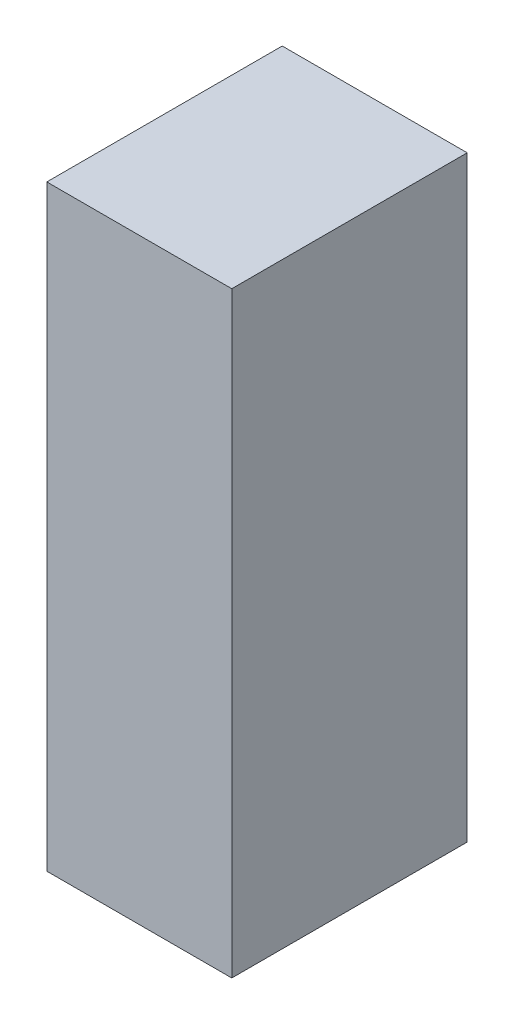
ISO-10303-21;
HEADER;
FILE_DESCRIPTION(('STEP AP214'),'2;1');
FILE_NAME('part.step','',(''),(''),'','','');
FILE_SCHEMA(('AUTOMOTIVE_DESIGN { 1 0 10303 214 1 1 1 1 }'));
ENDSEC;
DATA;
#1=APPLICATION_CONTEXT('core data for automotive mechanical design processes');
#2=APPLICATION_PROTOCOL_DEFINITION('international standard','automotive_design',2000,#1);
#3=PRODUCT_CONTEXT('',#1,'mechanical');
#4=PRODUCT('Part','Part','',(#3));
#5=PRODUCT_RELATED_PRODUCT_CATEGORY('part','',(#4));
#6=PRODUCT_DEFINITION_FORMATION('','',#4);
#7=PRODUCT_DEFINITION_CONTEXT('part definition',#1,'design');
#8=PRODUCT_DEFINITION('design','',#6,#7);
#9=PRODUCT_DEFINITION_SHAPE('','',#8);
#10=(LENGTH_UNIT() NAMED_UNIT(*) SI_UNIT(.MILLI.,.METRE.));
#11=(NAMED_UNIT(*) PLANE_ANGLE_UNIT() SI_UNIT($,.RADIAN.));
#12=(NAMED_UNIT(*) SI_UNIT($,.STERADIAN.) SOLID_ANGLE_UNIT());
#13=UNCERTAINTY_MEASURE_WITH_UNIT(LENGTH_MEASURE(1.E-05),#10,'distance_accuracy_value','');
#14=(GEOMETRIC_REPRESENTATION_CONTEXT(3) GLOBAL_UNCERTAINTY_ASSIGNED_CONTEXT((#13)) GLOBAL_UNIT_ASSIGNED_CONTEXT((#10,
#11,#12)) REPRESENTATION_CONTEXT('',''));
#15=CARTESIAN_POINT('',(0.,0.,0.));
#16=DIRECTION('',(0.,0.,1.));
#17=DIRECTION('',(1.,0.,0.));
#18=AXIS2_PLACEMENT_3D('',#15,#16,#17);
#19=CARTESIAN_POINT('',(-22.,71.,56.));
#20=DIRECTION('',(1.,0.,0.));
#21=DIRECTION('',(0.,0.,-1.));
#22=AXIS2_PLACEMENT_3D('',#19,#20,#21);
#23=PLANE('',#22);
#24=DIRECTION('',(0.,-1.,0.));
#25=VECTOR('',#24,1.);
#26=CARTESIAN_POINT('',(-22.,71.,0.));
#27=LINE('',#26,#25);
#28=CARTESIAN_POINT('',(-22.,71.,0.));
#29=VERTEX_POINT('',#28);
#30=CARTESIAN_POINT('',(-22.,-71.,0.));
#31=VERTEX_POINT('',#30);
#32=EDGE_CURVE('E102',#29,#31,#27,.T.);
#33=ORIENTED_EDGE('',*,*,#32,.T.);
#34=DIRECTION('',(0.,0.,-1.));
#35=VECTOR('',#34,1.);
#36=CARTESIAN_POINT('',(-22.,-71.,56.));
#37=LINE('',#36,#35);
#38=CARTESIAN_POINT('',(-22.,-71.,56.));
#39=VERTEX_POINT('',#38);
#40=EDGE_CURVE('E11',#39,#31,#37,.T.);
#41=ORIENTED_EDGE('',*,*,#40,.F.);
#42=DIRECTION('',(0.,-1.,0.));
#43=VECTOR('',#42,1.);
#44=CARTESIAN_POINT('',(-22.,71.,56.));
#45=LINE('',#44,#43);
#46=CARTESIAN_POINT('',(-22.,71.,56.));
#47=VERTEX_POINT('',#46);
#48=EDGE_CURVE('E90',#47,#39,#45,.T.);
#49=ORIENTED_EDGE('',*,*,#48,.F.);
#50=DIRECTION('',(0.,0.,-1.));
#51=VECTOR('',#50,1.);
#52=CARTESIAN_POINT('',(-22.,71.,56.));
#53=LINE('',#52,#51);
#54=EDGE_CURVE('E98',#47,#29,#53,.T.);
#55=ORIENTED_EDGE('',*,*,#54,.T.);
#56=EDGE_LOOP('',(#33,#41,#49,#55));
#57=FACE_BOUND('',#56,.T.);
#58=ADVANCED_FACE('F39',(#57),#23,.F.);
#59=CARTESIAN_POINT('',(-22.,-71.,56.));
#60=DIRECTION('',(0.,1.,0.));
#61=DIRECTION('',(0.,0.,1.));
#62=AXIS2_PLACEMENT_3D('',#59,#60,#61);
#63=PLANE('',#62);
#64=DIRECTION('',(1.,0.,0.));
#65=VECTOR('',#64,1.);
#66=CARTESIAN_POINT('',(-22.,-71.,0.));
#67=LINE('',#66,#65);
#68=CARTESIAN_POINT('',(22.,-71.,0.));
#69=VERTEX_POINT('',#68);
#70=EDGE_CURVE('E94',#31,#69,#67,.T.);
#71=ORIENTED_EDGE('',*,*,#70,.T.);
#72=DIRECTION('',(0.,0.,-1.));
#73=VECTOR('',#72,1.);
#74=CARTESIAN_POINT('',(22.,-71.,56.));
#75=LINE('',#74,#73);
#76=CARTESIAN_POINT('',(22.,-71.,56.));
#77=VERTEX_POINT('',#76);
#78=EDGE_CURVE('E47',#77,#69,#75,.T.);
#79=ORIENTED_EDGE('',*,*,#78,.F.);
#80=DIRECTION('',(1.,0.,0.));
#81=VECTOR('',#80,1.);
#82=CARTESIAN_POINT('',(-22.,-71.,56.));
#83=LINE('',#82,#81);
#84=EDGE_CURVE('E85',#39,#77,#83,.T.);
#85=ORIENTED_EDGE('',*,*,#84,.F.);
#86=ORIENTED_EDGE('',*,*,#40,.T.);
#87=EDGE_LOOP('',(#71,#79,#85,#86));
#88=FACE_BOUND('',#87,.T.);
#89=ADVANCED_FACE('F93',(#88),#63,.F.);
#90=CARTESIAN_POINT('',(22.,-71.,56.));
#91=DIRECTION('',(-1.,0.,0.));
#92=DIRECTION('',(0.,0.,1.));
#93=AXIS2_PLACEMENT_3D('',#90,#91,#92);
#94=PLANE('',#93);
#95=DIRECTION('',(0.,1.,0.));
#96=VECTOR('',#95,1.);
#97=CARTESIAN_POINT('',(22.,-71.,0.));
#98=LINE('',#97,#96);
#99=CARTESIAN_POINT('',(22.,71.,0.));
#100=VERTEX_POINT('',#99);
#101=EDGE_CURVE('E72',#69,#100,#98,.T.);
#102=ORIENTED_EDGE('',*,*,#101,.T.);
#103=DIRECTION('',(0.,0.,-1.));
#104=VECTOR('',#103,1.);
#105=CARTESIAN_POINT('',(22.,71.,56.));
#106=LINE('',#105,#104);
#107=CARTESIAN_POINT('',(22.,71.,56.));
#108=VERTEX_POINT('',#107);
#109=EDGE_CURVE('E95',#108,#100,#106,.T.);
#110=ORIENTED_EDGE('',*,*,#109,.F.);
#111=DIRECTION('',(0.,1.,0.));
#112=VECTOR('',#111,1.);
#113=CARTESIAN_POINT('',(22.,-71.,56.));
#114=LINE('',#113,#112);
#115=EDGE_CURVE('E88',#77,#108,#114,.T.);
#116=ORIENTED_EDGE('',*,*,#115,.F.);
#117=ORIENTED_EDGE('',*,*,#78,.T.);
#118=EDGE_LOOP('',(#102,#110,#116,#117));
#119=FACE_BOUND('',#118,.T.);
#120=ADVANCED_FACE('F96',(#119),#94,.F.);
#121=CARTESIAN_POINT('',(22.,71.,56.));
#122=DIRECTION('',(0.,-1.,0.));
#123=DIRECTION('',(0.,0.,-1.));
#124=AXIS2_PLACEMENT_3D('',#121,#122,#123);
#125=PLANE('',#124);
#126=DIRECTION('',(-1.,0.,0.));
#127=VECTOR('',#126,1.);
#128=CARTESIAN_POINT('',(22.,71.,0.));
#129=LINE('',#128,#127);
#130=EDGE_CURVE('E78',#100,#29,#129,.T.);
#131=ORIENTED_EDGE('',*,*,#130,.T.);
#132=ORIENTED_EDGE('',*,*,#54,.F.);
#133=DIRECTION('',(-1.,0.,0.));
#134=VECTOR('',#133,1.);
#135=CARTESIAN_POINT('',(22.,71.,56.));
#136=LINE('',#135,#134);
#137=EDGE_CURVE('E55',#108,#47,#136,.T.);
#138=ORIENTED_EDGE('',*,*,#137,.F.);
#139=ORIENTED_EDGE('',*,*,#109,.T.);
#140=EDGE_LOOP('',(#131,#132,#138,#139));
#141=FACE_BOUND('',#140,.T.);
#142=ADVANCED_FACE('F109',(#141),#125,.F.);
#143=CARTESIAN_POINT('',(0.,0.,56.));
#144=DIRECTION('',(0.,0.,1.));
#145=DIRECTION('',(1.,0.,0.));
#146=AXIS2_PLACEMENT_3D('',#143,#144,#145);
#147=PLANE('',#146);
#148=ORIENTED_EDGE('',*,*,#48,.T.);
#149=ORIENTED_EDGE('',*,*,#84,.T.);
#150=ORIENTED_EDGE('',*,*,#115,.T.);
#151=ORIENTED_EDGE('',*,*,#137,.T.);
#152=EDGE_LOOP('',(#148,#149,#150,#151));
#153=FACE_BOUND('',#152,.T.);
#154=ADVANCED_FACE('F86',(#153),#147,.T.);
#155=CARTESIAN_POINT('',(0.,0.,0.));
#156=DIRECTION('',(0.,0.,1.));
#157=DIRECTION('',(1.,0.,0.));
#158=AXIS2_PLACEMENT_3D('',#155,#156,#157);
#159=PLANE('',#158);
#160=ORIENTED_EDGE('',*,*,#32,.F.);
#161=ORIENTED_EDGE('',*,*,#130,.F.);
#162=ORIENTED_EDGE('',*,*,#101,.F.);
#163=ORIENTED_EDGE('',*,*,#70,.F.);
#164=EDGE_LOOP('',(#160,#161,#162,#163));
#165=FACE_BOUND('',#164,.T.);
#166=ADVANCED_FACE('F112',(#165),#159,.F.);
#167=CLOSED_SHELL('',(#58,#89,#120,#142,#154,#166));
#168=MANIFOLD_SOLID_BREP('B2',#167);
#169=ADVANCED_BREP_SHAPE_REPRESENTATION('',(#18,#168),#14);
#170=SHAPE_DEFINITION_REPRESENTATION(#9,#169);
ENDSEC;
END-ISO-10303-21;
